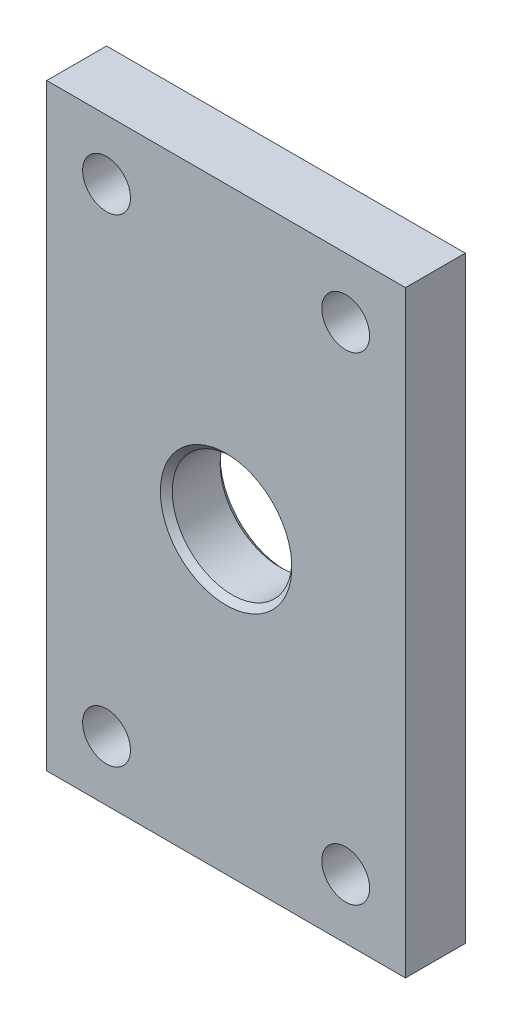
ISO-10303-21;
HEADER;
FILE_DESCRIPTION(('STEP AP214'),'2;1');
FILE_NAME('part.step','',(''),(''),'','','');
FILE_SCHEMA(('AUTOMOTIVE_DESIGN { 1 0 10303 214 1 1 1 1 }'));
ENDSEC;
DATA;
#1=APPLICATION_CONTEXT('core data for automotive mechanical design processes');
#2=APPLICATION_PROTOCOL_DEFINITION('international standard','automotive_design',2000,#1);
#3=PRODUCT_CONTEXT('',#1,'mechanical');
#4=PRODUCT('Part','Part','',(#3));
#5=PRODUCT_RELATED_PRODUCT_CATEGORY('part','',(#4));
#6=PRODUCT_DEFINITION_FORMATION('','',#4);
#7=PRODUCT_DEFINITION_CONTEXT('part definition',#1,'design');
#8=PRODUCT_DEFINITION('design','',#6,#7);
#9=PRODUCT_DEFINITION_SHAPE('','',#8);
#10=(LENGTH_UNIT() NAMED_UNIT(*) SI_UNIT(.MILLI.,.METRE.));
#11=(NAMED_UNIT(*) PLANE_ANGLE_UNIT() SI_UNIT($,.RADIAN.));
#12=(NAMED_UNIT(*) SI_UNIT($,.STERADIAN.) SOLID_ANGLE_UNIT());
#13=UNCERTAINTY_MEASURE_WITH_UNIT(LENGTH_MEASURE(1.E-05),#10,'distance_accuracy_value','');
#14=(GEOMETRIC_REPRESENTATION_CONTEXT(3) GLOBAL_UNCERTAINTY_ASSIGNED_CONTEXT((#13)) GLOBAL_UNIT_ASSIGNED_CONTEXT((#10,
#11,#12)) REPRESENTATION_CONTEXT('',''));
#15=CARTESIAN_POINT('',(0.,0.,0.));
#16=DIRECTION('',(0.,0.,1.));
#17=DIRECTION('',(1.,0.,0.));
#18=AXIS2_PLACEMENT_3D('',#15,#16,#17);
#19=CARTESIAN_POINT('',(30.,50.,5.));
#20=DIRECTION('',(0.,-1.,0.));
#21=DIRECTION('',(0.,0.,-1.));
#22=AXIS2_PLACEMENT_3D('',#19,#20,#21);
#23=PLANE('',#22);
#24=DIRECTION('',(-1.,0.,0.));
#25=VECTOR('',#24,1.);
#26=CARTESIAN_POINT('',(30.,50.,-5.));
#27=LINE('',#26,#25);
#28=CARTESIAN_POINT('',(30.,50.,-5.));
#29=VERTEX_POINT('',#28);
#30=CARTESIAN_POINT('',(-30.,50.,-5.));
#31=VERTEX_POINT('',#30);
#32=EDGE_CURVE('E114',#29,#31,#27,.T.);
#33=ORIENTED_EDGE('',*,*,#32,.T.);
#34=DIRECTION('',(0.,0.,-1.));
#35=VECTOR('',#34,1.);
#36=CARTESIAN_POINT('',(-30.,50.,5.));
#37=LINE('',#36,#35);
#38=CARTESIAN_POINT('',(-30.,50.,5.));
#39=VERTEX_POINT('',#38);
#40=EDGE_CURVE('E105',#39,#31,#37,.T.);
#41=ORIENTED_EDGE('',*,*,#40,.F.);
#42=DIRECTION('',(-1.,0.,0.));
#43=VECTOR('',#42,1.);
#44=CARTESIAN_POINT('',(30.,50.,5.));
#45=LINE('',#44,#43);
#46=CARTESIAN_POINT('',(30.,50.,5.));
#47=VERTEX_POINT('',#46);
#48=EDGE_CURVE('E99',#47,#39,#45,.T.);
#49=ORIENTED_EDGE('',*,*,#48,.F.);
#50=DIRECTION('',(0.,0.,-1.));
#51=VECTOR('',#50,1.);
#52=CARTESIAN_POINT('',(30.,50.,5.));
#53=LINE('',#52,#51);
#54=EDGE_CURVE('E110',#47,#29,#53,.T.);
#55=ORIENTED_EDGE('',*,*,#54,.T.);
#56=EDGE_LOOP('',(#33,#41,#49,#55));
#57=FACE_BOUND('',#56,.T.);
#58=ADVANCED_FACE('F45',(#57),#23,.F.);
#59=CARTESIAN_POINT('',(-30.,-50.,5.));
#60=DIRECTION('',(1.,0.,0.));
#61=DIRECTION('',(0.,0.,-1.));
#62=AXIS2_PLACEMENT_3D('',#59,#60,#61);
#63=PLANE('',#62);
#64=DIRECTION('',(0.,-1.,0.));
#65=VECTOR('',#64,1.);
#66=CARTESIAN_POINT('',(-30.,-50.,-5.));
#67=LINE('',#66,#65);
#68=CARTESIAN_POINT('',(-30.,-50.,-5.));
#69=VERTEX_POINT('',#68);
#70=EDGE_CURVE('E104',#31,#69,#67,.T.);
#71=ORIENTED_EDGE('',*,*,#70,.T.);
#72=DIRECTION('',(0.,0.,-1.));
#73=VECTOR('',#72,1.);
#74=CARTESIAN_POINT('',(-30.,-50.,5.));
#75=LINE('',#74,#73);
#76=CARTESIAN_POINT('',(-30.,-50.,5.));
#77=VERTEX_POINT('',#76);
#78=EDGE_CURVE('E102',#77,#69,#75,.T.);
#79=ORIENTED_EDGE('',*,*,#78,.F.);
#80=DIRECTION('',(0.,-1.,0.));
#81=VECTOR('',#80,1.);
#82=CARTESIAN_POINT('',(-30.,-50.,5.));
#83=LINE('',#82,#81);
#84=EDGE_CURVE('E94',#39,#77,#83,.T.);
#85=ORIENTED_EDGE('',*,*,#84,.F.);
#86=ORIENTED_EDGE('',*,*,#40,.T.);
#87=EDGE_LOOP('',(#71,#79,#85,#86));
#88=FACE_BOUND('',#87,.T.);
#89=ADVANCED_FACE('F103',(#88),#63,.F.);
#90=CARTESIAN_POINT('',(30.,-50.,5.));
#91=DIRECTION('',(0.,1.,0.));
#92=DIRECTION('',(0.,0.,1.));
#93=AXIS2_PLACEMENT_3D('',#90,#91,#92);
#94=PLANE('',#93);
#95=DIRECTION('',(1.,0.,0.));
#96=VECTOR('',#95,1.);
#97=CARTESIAN_POINT('',(30.,-50.,-5.));
#98=LINE('',#97,#96);
#99=CARTESIAN_POINT('',(30.,-50.,-5.));
#100=VERTEX_POINT('',#99);
#101=EDGE_CURVE('E80',#69,#100,#98,.T.);
#102=ORIENTED_EDGE('',*,*,#101,.T.);
#103=DIRECTION('',(0.,0.,-1.));
#104=VECTOR('',#103,1.);
#105=CARTESIAN_POINT('',(30.,-50.,5.));
#106=LINE('',#105,#104);
#107=CARTESIAN_POINT('',(30.,-50.,5.));
#108=VERTEX_POINT('',#107);
#109=EDGE_CURVE('E106',#108,#100,#106,.T.);
#110=ORIENTED_EDGE('',*,*,#109,.F.);
#111=DIRECTION('',(1.,0.,0.));
#112=VECTOR('',#111,1.);
#113=CARTESIAN_POINT('',(30.,-50.,5.));
#114=LINE('',#113,#112);
#115=EDGE_CURVE('E97',#77,#108,#114,.T.);
#116=ORIENTED_EDGE('',*,*,#115,.F.);
#117=ORIENTED_EDGE('',*,*,#78,.T.);
#118=EDGE_LOOP('',(#102,#110,#116,#117));
#119=FACE_BOUND('',#118,.T.);
#120=ADVANCED_FACE('F108',(#119),#94,.F.);
#121=CARTESIAN_POINT('',(30.,-50.,5.));
#122=DIRECTION('',(-1.,0.,0.));
#123=DIRECTION('',(0.,0.,1.));
#124=AXIS2_PLACEMENT_3D('',#121,#122,#123);
#125=PLANE('',#124);
#126=DIRECTION('',(0.,1.,0.));
#127=VECTOR('',#126,1.);
#128=CARTESIAN_POINT('',(30.,-50.,-5.));
#129=LINE('',#128,#127);
#130=EDGE_CURVE('E86',#100,#29,#129,.T.);
#131=ORIENTED_EDGE('',*,*,#130,.T.);
#132=ORIENTED_EDGE('',*,*,#54,.F.);
#133=DIRECTION('',(0.,1.,0.));
#134=VECTOR('',#133,1.);
#135=CARTESIAN_POINT('',(30.,-50.,5.));
#136=LINE('',#135,#134);
#137=EDGE_CURVE('E63',#108,#47,#136,.T.);
#138=ORIENTED_EDGE('',*,*,#137,.F.);
#139=ORIENTED_EDGE('',*,*,#109,.T.);
#140=EDGE_LOOP('',(#131,#132,#138,#139));
#141=FACE_BOUND('',#140,.T.);
#142=ADVANCED_FACE('F162',(#141),#125,.F.);
#143=CARTESIAN_POINT('',(0.,0.,5.));
#144=DIRECTION('',(0.,0.,-1.));
#145=DIRECTION('',(-1.,0.,0.));
#146=AXIS2_PLACEMENT_3D('',#143,#144,#145);
#147=PLANE('',#146);
#148=CARTESIAN_POINT('',(0.,0.,5.));
#149=DIRECTION('',(0.,0.,-1.));
#150=DIRECTION('',(-1.,0.,0.));
#151=AXIS2_PLACEMENT_3D('',#148,#149,#150);
#152=CIRCLE('',#151,11.);
#153=CARTESIAN_POINT('',(-11.,0.,5.));
#154=VERTEX_POINT('',#153);
#155=EDGE_CURVE('E11',#154,#154,#152,.T.);
#156=ORIENTED_EDGE('',*,*,#155,.T.);
#157=EDGE_LOOP('',(#156));
#158=FACE_BOUND('',#157,.T.);
#159=CARTESIAN_POINT('',(20.,40.,5.));
#160=DIRECTION('',(0.,0.,1.));
#161=DIRECTION('',(1.,0.,0.));
#162=AXIS2_PLACEMENT_3D('',#159,#160,#161);
#163=CIRCLE('',#162,4.);
#164=CARTESIAN_POINT('',(24.,40.,5.));
#165=VERTEX_POINT('',#164);
#166=EDGE_CURVE('E278',#165,#165,#163,.T.);
#167=ORIENTED_EDGE('',*,*,#166,.F.);
#168=EDGE_LOOP('',(#167));
#169=FACE_BOUND('',#168,.T.);
#170=CARTESIAN_POINT('',(-20.,-40.,5.));
#171=DIRECTION('',(0.,0.,1.));
#172=DIRECTION('',(1.,0.,0.));
#173=AXIS2_PLACEMENT_3D('',#170,#171,#172);
#174=CIRCLE('',#173,4.);
#175=CARTESIAN_POINT('',(-16.,-40.,5.));
#176=VERTEX_POINT('',#175);
#177=EDGE_CURVE('E282',#176,#176,#174,.T.);
#178=ORIENTED_EDGE('',*,*,#177,.F.);
#179=EDGE_LOOP('',(#178));
#180=FACE_BOUND('',#179,.T.);
#181=CARTESIAN_POINT('',(-20.,40.,5.));
#182=DIRECTION('',(0.,0.,1.));
#183=DIRECTION('',(1.,0.,0.));
#184=AXIS2_PLACEMENT_3D('',#181,#182,#183);
#185=CIRCLE('',#184,4.);
#186=CARTESIAN_POINT('',(-16.,40.,5.));
#187=VERTEX_POINT('',#186);
#188=EDGE_CURVE('E286',#187,#187,#185,.T.);
#189=ORIENTED_EDGE('',*,*,#188,.F.);
#190=EDGE_LOOP('',(#189));
#191=FACE_BOUND('',#190,.T.);
#192=CARTESIAN_POINT('',(20.,-40.,5.));
#193=DIRECTION('',(0.,0.,1.));
#194=DIRECTION('',(1.,0.,0.));
#195=AXIS2_PLACEMENT_3D('',#192,#193,#194);
#196=CIRCLE('',#195,4.);
#197=CARTESIAN_POINT('',(24.,-40.,5.));
#198=VERTEX_POINT('',#197);
#199=EDGE_CURVE('E289',#198,#198,#196,.T.);
#200=ORIENTED_EDGE('',*,*,#199,.F.);
#201=EDGE_LOOP('',(#200));
#202=FACE_BOUND('',#201,.T.);
#203=ORIENTED_EDGE('',*,*,#48,.T.);
#204=ORIENTED_EDGE('',*,*,#84,.T.);
#205=ORIENTED_EDGE('',*,*,#115,.T.);
#206=ORIENTED_EDGE('',*,*,#137,.T.);
#207=EDGE_LOOP('',(#203,#204,#205,#206));
#208=FACE_BOUND('',#207,.T.);
#209=ADVANCED_FACE('F95',(#158,#169,#180,#191,#202,#208),#147,.F.);
#210=CARTESIAN_POINT('',(0.,0.,-5.));
#211=DIRECTION('',(0.,0.,-1.));
#212=DIRECTION('',(-1.,0.,0.));
#213=AXIS2_PLACEMENT_3D('',#210,#211,#212);
#214=PLANE('',#213);
#215=CARTESIAN_POINT('',(0.,0.,-5.));
#216=DIRECTION('',(0.,0.,-1.));
#217=DIRECTION('',(-1.,0.,0.));
#218=AXIS2_PLACEMENT_3D('',#215,#216,#217);
#219=CIRCLE('',#218,11.);
#220=CARTESIAN_POINT('',(-11.,0.,-5.));
#221=VERTEX_POINT('',#220);
#222=EDGE_CURVE('E124',#221,#221,#219,.F.);
#223=ORIENTED_EDGE('',*,*,#222,.T.);
#224=EDGE_LOOP('',(#223));
#225=FACE_BOUND('',#224,.T.);
#226=CARTESIAN_POINT('',(20.,40.,-5.));
#227=DIRECTION('',(0.,0.,1.));
#228=DIRECTION('',(1.,0.,0.));
#229=AXIS2_PLACEMENT_3D('',#226,#227,#228);
#230=CIRCLE('',#229,4.);
#231=CARTESIAN_POINT('',(24.,40.,-5.));
#232=VERTEX_POINT('',#231);
#233=EDGE_CURVE('E148',#232,#232,#230,.T.);
#234=ORIENTED_EDGE('',*,*,#233,.T.);
#235=EDGE_LOOP('',(#234));
#236=FACE_BOUND('',#235,.T.);
#237=CARTESIAN_POINT('',(-20.,-40.,-5.));
#238=DIRECTION('',(0.,0.,1.));
#239=DIRECTION('',(1.,0.,0.));
#240=AXIS2_PLACEMENT_3D('',#237,#238,#239);
#241=CIRCLE('',#240,4.);
#242=CARTESIAN_POINT('',(-16.,-40.,-5.));
#243=VERTEX_POINT('',#242);
#244=EDGE_CURVE('E152',#243,#243,#241,.T.);
#245=ORIENTED_EDGE('',*,*,#244,.T.);
#246=EDGE_LOOP('',(#245));
#247=FACE_BOUND('',#246,.T.);
#248=CARTESIAN_POINT('',(-20.,40.,-5.));
#249=DIRECTION('',(0.,0.,1.));
#250=DIRECTION('',(1.,0.,0.));
#251=AXIS2_PLACEMENT_3D('',#248,#249,#250);
#252=CIRCLE('',#251,4.);
#253=CARTESIAN_POINT('',(-16.,40.,-5.));
#254=VERTEX_POINT('',#253);
#255=EDGE_CURVE('E156',#254,#254,#252,.T.);
#256=ORIENTED_EDGE('',*,*,#255,.T.);
#257=EDGE_LOOP('',(#256));
#258=FACE_BOUND('',#257,.T.);
#259=CARTESIAN_POINT('',(20.,-40.,-5.));
#260=DIRECTION('',(0.,0.,1.));
#261=DIRECTION('',(1.,0.,0.));
#262=AXIS2_PLACEMENT_3D('',#259,#260,#261);
#263=CIRCLE('',#262,4.);
#264=CARTESIAN_POINT('',(24.,-40.,-5.));
#265=VERTEX_POINT('',#264);
#266=EDGE_CURVE('E117',#265,#265,#263,.T.);
#267=ORIENTED_EDGE('',*,*,#266,.T.);
#268=EDGE_LOOP('',(#267));
#269=FACE_BOUND('',#268,.T.);
#270=ORIENTED_EDGE('',*,*,#32,.F.);
#271=ORIENTED_EDGE('',*,*,#130,.F.);
#272=ORIENTED_EDGE('',*,*,#101,.F.);
#273=ORIENTED_EDGE('',*,*,#70,.F.);
#274=EDGE_LOOP('',(#270,#271,#272,#273));
#275=FACE_BOUND('',#274,.T.);
#276=ADVANCED_FACE('F140',(#225,#236,#247,#258,#269,#275),#214,.T.);
#277=CARTESIAN_POINT('',(20.,-40.,-5.));
#278=DIRECTION('',(0.,0.,1.));
#279=DIRECTION('',(1.,0.,0.));
#280=AXIS2_PLACEMENT_3D('',#277,#278,#279);
#281=CYLINDRICAL_SURFACE('',#280,4.);
#282=ORIENTED_EDGE('',*,*,#266,.F.);
#283=EDGE_LOOP('',(#282));
#284=FACE_BOUND('',#283,.T.);
#285=ORIENTED_EDGE('',*,*,#199,.T.);
#286=EDGE_LOOP('',(#285));
#287=FACE_BOUND('',#286,.T.);
#288=ADVANCED_FACE('F143',(#284,#287),#281,.F.);
#289=CARTESIAN_POINT('',(-20.,40.,-5.));
#290=DIRECTION('',(0.,0.,1.));
#291=DIRECTION('',(1.,0.,0.));
#292=AXIS2_PLACEMENT_3D('',#289,#290,#291);
#293=CYLINDRICAL_SURFACE('',#292,4.);
#294=ORIENTED_EDGE('',*,*,#255,.F.);
#295=EDGE_LOOP('',(#294));
#296=FACE_BOUND('',#295,.T.);
#297=ORIENTED_EDGE('',*,*,#188,.T.);
#298=EDGE_LOOP('',(#297));
#299=FACE_BOUND('',#298,.T.);
#300=ADVANCED_FACE('F218',(#296,#299),#293,.F.);
#301=CARTESIAN_POINT('',(-20.,-40.,-5.));
#302=DIRECTION('',(0.,0.,1.));
#303=DIRECTION('',(1.,0.,0.));
#304=AXIS2_PLACEMENT_3D('',#301,#302,#303);
#305=CYLINDRICAL_SURFACE('',#304,4.);
#306=ORIENTED_EDGE('',*,*,#244,.F.);
#307=EDGE_LOOP('',(#306));
#308=FACE_BOUND('',#307,.T.);
#309=ORIENTED_EDGE('',*,*,#177,.T.);
#310=EDGE_LOOP('',(#309));
#311=FACE_BOUND('',#310,.T.);
#312=ADVANCED_FACE('F228',(#308,#311),#305,.F.);
#313=CARTESIAN_POINT('',(20.,40.,-5.));
#314=DIRECTION('',(0.,0.,1.));
#315=DIRECTION('',(1.,0.,0.));
#316=AXIS2_PLACEMENT_3D('',#313,#314,#315);
#317=CYLINDRICAL_SURFACE('',#316,4.);
#318=ORIENTED_EDGE('',*,*,#233,.F.);
#319=EDGE_LOOP('',(#318));
#320=FACE_BOUND('',#319,.T.);
#321=ORIENTED_EDGE('',*,*,#166,.T.);
#322=EDGE_LOOP('',(#321));
#323=FACE_BOUND('',#322,.T.);
#324=ADVANCED_FACE('F238',(#320,#323),#317,.F.);
#325=CARTESIAN_POINT('',(0.,0.,-5.));
#326=DIRECTION('',(0.,0.,1.));
#327=DIRECTION('',(1.,0.,0.));
#328=AXIS2_PLACEMENT_3D('',#325,#326,#327);
#329=CYLINDRICAL_SURFACE('',#328,10.);
#330=CARTESIAN_POINT('',(0.,0.,-3.99999999999999));
#331=DIRECTION('',(0.,0.,-1.));
#332=DIRECTION('',(-1.,0.,0.));
#333=AXIS2_PLACEMENT_3D('',#330,#331,#332);
#334=CIRCLE('',#333,10.);
#335=CARTESIAN_POINT('',(-10.,0.,-3.99999999999999));
#336=VERTEX_POINT('',#335);
#337=EDGE_CURVE('E55',#336,#336,#334,.T.);
#338=ORIENTED_EDGE('',*,*,#337,.T.);
#339=EDGE_LOOP('',(#338));
#340=FACE_BOUND('',#339,.T.);
#341=CARTESIAN_POINT('',(0.,0.,4.));
#342=DIRECTION('',(0.,0.,-1.));
#343=DIRECTION('',(-1.,0.,0.));
#344=AXIS2_PLACEMENT_3D('',#341,#342,#343);
#345=CIRCLE('',#344,10.);
#346=CARTESIAN_POINT('',(-10.,0.,4.));
#347=VERTEX_POINT('',#346);
#348=EDGE_CURVE('E127',#347,#347,#345,.F.);
#349=ORIENTED_EDGE('',*,*,#348,.T.);
#350=EDGE_LOOP('',(#349));
#351=FACE_BOUND('',#350,.T.);
#352=ADVANCED_FACE('F132',(#340,#351),#329,.F.);
#353=CARTESIAN_POINT('',(0.,0.,-5.));
#354=DIRECTION('',(0.,0.,-1.));
#355=DIRECTION('',(-1.,0.,0.));
#356=AXIS2_PLACEMENT_3D('',#353,#354,#355);
#357=CONICAL_SURFACE('',#356,11.,0.785398163397441);
#358=ORIENTED_EDGE('',*,*,#337,.F.);
#359=EDGE_LOOP('',(#358));
#360=FACE_BOUND('',#359,.T.);
#361=ORIENTED_EDGE('',*,*,#222,.F.);
#362=EDGE_LOOP('',(#361));
#363=FACE_BOUND('',#362,.T.);
#364=ADVANCED_FACE('F135',(#360,#363),#357,.F.);
#365=CARTESIAN_POINT('',(0.,0.,4.));
#366=DIRECTION('',(0.,0.,1.));
#367=DIRECTION('',(1.,0.,0.));
#368=AXIS2_PLACEMENT_3D('',#365,#366,#367);
#369=CONICAL_SURFACE('',#368,10.,0.785398163397455);
#370=ORIENTED_EDGE('',*,*,#155,.F.);
#371=EDGE_LOOP('',(#370));
#372=FACE_BOUND('',#371,.T.);
#373=ORIENTED_EDGE('',*,*,#348,.F.);
#374=EDGE_LOOP('',(#373));
#375=FACE_BOUND('',#374,.T.);
#376=ADVANCED_FACE('F48',(#372,#375),#369,.F.);
#377=CLOSED_SHELL('',(#58,#89,#120,#142,#209,#276,#288,#300,#312,#324,#352,#364,#376));
#378=MANIFOLD_SOLID_BREP('B2',#377);
#379=ADVANCED_BREP_SHAPE_REPRESENTATION('',(#18,#378),#14);
#380=SHAPE_DEFINITION_REPRESENTATION(#9,#379);
ENDSEC;
END-ISO-10303-21;
